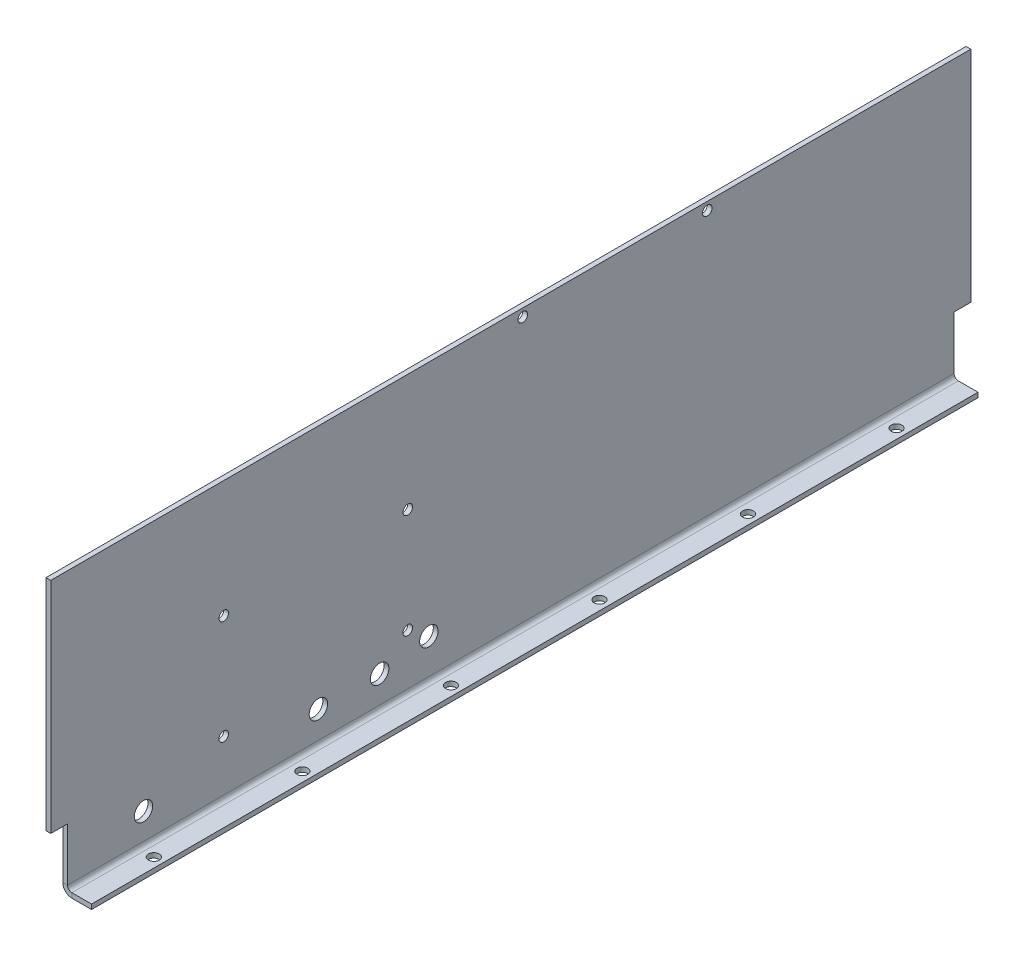
ISO-10303-21;
HEADER;
FILE_DESCRIPTION(('STEP AP214'),'2;1');
FILE_NAME('part.step','',(''),(''),'','','');
FILE_SCHEMA(('AUTOMOTIVE_DESIGN { 1 0 10303 214 1 1 1 1 }'));
ENDSEC;
DATA;
#1=APPLICATION_CONTEXT('core data for automotive mechanical design processes');
#2=APPLICATION_PROTOCOL_DEFINITION('international standard','automotive_design',2000,#1);
#3=PRODUCT_CONTEXT('',#1,'mechanical');
#4=PRODUCT('Part','Part','',(#3));
#5=PRODUCT_RELATED_PRODUCT_CATEGORY('part','',(#4));
#6=PRODUCT_DEFINITION_FORMATION('','',#4);
#7=PRODUCT_DEFINITION_CONTEXT('part definition',#1,'design');
#8=PRODUCT_DEFINITION('design','',#6,#7);
#9=PRODUCT_DEFINITION_SHAPE('','',#8);
#10=(LENGTH_UNIT() NAMED_UNIT(*) SI_UNIT(.MILLI.,.METRE.));
#11=(NAMED_UNIT(*) PLANE_ANGLE_UNIT() SI_UNIT($,.RADIAN.));
#12=(NAMED_UNIT(*) SI_UNIT($,.STERADIAN.) SOLID_ANGLE_UNIT());
#13=UNCERTAINTY_MEASURE_WITH_UNIT(LENGTH_MEASURE(1.E-05),#10,'distance_accuracy_value','');
#14=(GEOMETRIC_REPRESENTATION_CONTEXT(3) GLOBAL_UNCERTAINTY_ASSIGNED_CONTEXT((#13)) GLOBAL_UNIT_ASSIGNED_CONTEXT((#10,
#11,#12)) REPRESENTATION_CONTEXT('',''));
#15=CARTESIAN_POINT('',(0.,0.,0.));
#16=DIRECTION('',(0.,0.,1.));
#17=DIRECTION('',(1.,0.,0.));
#18=AXIS2_PLACEMENT_3D('',#15,#16,#17);
#19=CARTESIAN_POINT('',(-86.,25.9999999999999,380.000000000001));
#20=DIRECTION('',(0.,0.,-1.));
#21=DIRECTION('',(-1.,0.,0.));
#22=AXIS2_PLACEMENT_3D('',#19,#20,#21);
#23=PLANE('',#22);
#24=DIRECTION('',(0.,1.,0.));
#25=VECTOR('',#24,1.);
#26=CARTESIAN_POINT('',(0.,120.,380.000000000001));
#27=LINE('',#26,#25);
#28=CARTESIAN_POINT('',(0.,3.8,380.000000000001));
#29=VERTEX_POINT('',#28);
#30=CARTESIAN_POINT('',(0.,25.9999999999999,380.000000000001));
#31=VERTEX_POINT('',#30);
#32=EDGE_CURVE('E207',#29,#31,#27,.T.);
#33=ORIENTED_EDGE('',*,*,#32,.F.);
#34=DIRECTION('',(1.,0.,0.));
#35=VECTOR('',#34,1.);
#36=CARTESIAN_POINT('',(0.,3.8,380.000000000001));
#37=LINE('',#36,#35);
#38=CARTESIAN_POINT('',(2.,3.8,380.000000000001));
#39=VERTEX_POINT('',#38);
#40=EDGE_CURVE('E324',#29,#39,#37,.T.);
#41=ORIENTED_EDGE('',*,*,#40,.T.);
#42=DIRECTION('',(0.,1.,0.));
#43=VECTOR('',#42,1.);
#44=CARTESIAN_POINT('',(1.99999999999999,120.,380.000000000001));
#45=LINE('',#44,#43);
#46=CARTESIAN_POINT('',(2.,25.9999999999999,380.000000000001));
#47=VERTEX_POINT('',#46);
#48=EDGE_CURVE('E210',#39,#47,#45,.T.);
#49=ORIENTED_EDGE('',*,*,#48,.T.);
#50=DIRECTION('',(1.,0.,0.));
#51=VECTOR('',#50,1.);
#52=CARTESIAN_POINT('',(-86.,25.9999999999999,380.000000000001));
#53=LINE('',#52,#51);
#54=EDGE_CURVE('E192',#31,#47,#53,.T.);
#55=ORIENTED_EDGE('',*,*,#54,.F.);
#56=EDGE_LOOP('',(#33,#41,#49,#55));
#57=FACE_BOUND('',#56,.T.);
#58=ADVANCED_FACE('F38',(#57),#23,.F.);
#59=DIRECTION('',(-1.,0.,0.));
#60=VECTOR('',#59,1.);
#61=CARTESIAN_POINT('',(0.,2.,380.000000000001));
#62=LINE('',#61,#60);
#63=CARTESIAN_POINT('',(12.,2.,380.000000000001));
#64=VERTEX_POINT('',#63);
#65=CARTESIAN_POINT('',(3.8,2.,380.000000000001));
#66=VERTEX_POINT('',#65);
#67=EDGE_CURVE('E215',#64,#66,#62,.T.);
#68=ORIENTED_EDGE('',*,*,#67,.T.);
#69=DIRECTION('',(0.,-1.,0.));
#70=VECTOR('',#69,1.);
#71=CARTESIAN_POINT('',(3.8,2.,380.000000000001));
#72=LINE('',#71,#70);
#73=CARTESIAN_POINT('',(3.8,0.,380.000000000001));
#74=VERTEX_POINT('',#73);
#75=EDGE_CURVE('E322',#66,#74,#72,.T.);
#76=ORIENTED_EDGE('',*,*,#75,.T.);
#77=DIRECTION('',(1.,0.,0.));
#78=VECTOR('',#77,1.);
#79=CARTESIAN_POINT('',(-86.,0.,380.000000000001));
#80=LINE('',#79,#78);
#81=CARTESIAN_POINT('',(12.,0.,380.000000000001));
#82=VERTEX_POINT('',#81);
#83=EDGE_CURVE('E200',#74,#82,#80,.T.);
#84=ORIENTED_EDGE('',*,*,#83,.T.);
#85=DIRECTION('',(0.,1.,0.));
#86=VECTOR('',#85,1.);
#87=CARTESIAN_POINT('',(12.,25.9999999999999,380.000000000001));
#88=LINE('',#87,#86);
#89=EDGE_CURVE('E188',#82,#64,#88,.T.);
#90=ORIENTED_EDGE('',*,*,#89,.T.);
#91=EDGE_LOOP('',(#68,#76,#84,#90));
#92=FACE_BOUND('',#91,.T.);
#93=ADVANCED_FACE('F377',(#92),#23,.F.);
#94=CARTESIAN_POINT('',(-86.,25.9999999999999,9.99999999999923));
#95=DIRECTION('',(0.,0.,1.));
#96=DIRECTION('',(1.,0.,0.));
#97=AXIS2_PLACEMENT_3D('',#94,#95,#96);
#98=PLANE('',#97);
#99=DIRECTION('',(0.,-1.,0.));
#100=VECTOR('',#99,1.);
#101=CARTESIAN_POINT('',(1.99999999999999,120.,9.99999999999923));
#102=LINE('',#101,#100);
#103=CARTESIAN_POINT('',(2.,25.9999999999999,9.99999999999923));
#104=VERTEX_POINT('',#103);
#105=CARTESIAN_POINT('',(2.,3.8,9.99999999999923));
#106=VERTEX_POINT('',#105);
#107=EDGE_CURVE('E221',#104,#106,#102,.T.);
#108=ORIENTED_EDGE('',*,*,#107,.T.);
#109=DIRECTION('',(-1.,0.,0.));
#110=VECTOR('',#109,1.);
#111=CARTESIAN_POINT('',(2.,3.8,9.99999999999923));
#112=LINE('',#111,#110);
#113=CARTESIAN_POINT('',(0.,3.8,9.99999999999923));
#114=VERTEX_POINT('',#113);
#115=EDGE_CURVE('E320',#106,#114,#112,.T.);
#116=ORIENTED_EDGE('',*,*,#115,.T.);
#117=DIRECTION('',(0.,-1.,0.));
#118=VECTOR('',#117,1.);
#119=CARTESIAN_POINT('',(0.,120.,9.99999999999923));
#120=LINE('',#119,#118);
#121=CARTESIAN_POINT('',(0.,25.9999999999999,9.99999999999923));
#122=VERTEX_POINT('',#121);
#123=EDGE_CURVE('E218',#122,#114,#120,.T.);
#124=ORIENTED_EDGE('',*,*,#123,.F.);
#125=DIRECTION('',(1.,0.,0.));
#126=VECTOR('',#125,1.);
#127=CARTESIAN_POINT('',(-86.,25.9999999999999,9.99999999999923));
#128=LINE('',#127,#126);
#129=EDGE_CURVE('E191',#122,#104,#128,.T.);
#130=ORIENTED_EDGE('',*,*,#129,.T.);
#131=EDGE_LOOP('',(#108,#116,#124,#130));
#132=FACE_BOUND('',#131,.T.);
#133=ADVANCED_FACE('F336',(#132),#98,.F.);
#134=DIRECTION('',(1.,0.,0.));
#135=VECTOR('',#134,1.);
#136=CARTESIAN_POINT('',(-86.,0.,9.99999999999923));
#137=LINE('',#136,#135);
#138=CARTESIAN_POINT('',(3.8,0.,9.99999999999923));
#139=VERTEX_POINT('',#138);
#140=CARTESIAN_POINT('',(12.,0.,9.99999999999923));
#141=VERTEX_POINT('',#140);
#142=EDGE_CURVE('E193',#139,#141,#137,.T.);
#143=ORIENTED_EDGE('',*,*,#142,.F.);
#144=DIRECTION('',(0.,1.,0.));
#145=VECTOR('',#144,1.);
#146=CARTESIAN_POINT('',(3.8,0.,9.99999999999923));
#147=LINE('',#146,#145);
#148=CARTESIAN_POINT('',(3.8,2.,9.99999999999923));
#149=VERTEX_POINT('',#148);
#150=EDGE_CURVE('E300',#139,#149,#147,.T.);
#151=ORIENTED_EDGE('',*,*,#150,.T.);
#152=DIRECTION('',(1.,0.,0.));
#153=VECTOR('',#152,1.);
#154=CARTESIAN_POINT('',(0.,2.,9.99999999999923));
#155=LINE('',#154,#153);
#156=CARTESIAN_POINT('',(12.,2.,9.99999999999923));
#157=VERTEX_POINT('',#156);
#158=EDGE_CURVE('E227',#149,#157,#155,.T.);
#159=ORIENTED_EDGE('',*,*,#158,.T.);
#160=DIRECTION('',(0.,-1.,0.));
#161=VECTOR('',#160,1.);
#162=CARTESIAN_POINT('',(12.,25.9999999999999,9.99999999999923));
#163=LINE('',#162,#161);
#164=EDGE_CURVE('E189',#157,#141,#163,.T.);
#165=ORIENTED_EDGE('',*,*,#164,.T.);
#166=EDGE_LOOP('',(#143,#151,#159,#165));
#167=FACE_BOUND('',#166,.T.);
#168=ADVANCED_FACE('F353',(#167),#98,.F.);
#169=CARTESIAN_POINT('',(0.,0.,390.));
#170=DIRECTION('',(0.,1.,0.));
#171=DIRECTION('',(0.,0.,1.));
#172=AXIS2_PLACEMENT_3D('',#169,#170,#171);
#173=PLANE('',#172);
#174=CARTESIAN_POINT('',(8.,0.,350.));
#175=DIRECTION('',(0.,1.,0.));
#176=DIRECTION('',(0.,0.,1.));
#177=AXIS2_PLACEMENT_3D('',#174,#175,#176);
#178=CIRCLE('',#177,2.25);
#179=CARTESIAN_POINT('',(8.,0.,352.25));
#180=VERTEX_POINT('',#179);
#181=EDGE_CURVE('E185',#180,#180,#178,.T.);
#182=ORIENTED_EDGE('',*,*,#181,.T.);
#183=EDGE_LOOP('',(#182));
#184=FACE_BOUND('',#183,.T.);
#185=CARTESIAN_POINT('',(7.99999999999978,0.,288.));
#186=DIRECTION('',(0.,1.,0.));
#187=DIRECTION('',(0.,0.,1.));
#188=AXIS2_PLACEMENT_3D('',#185,#186,#187);
#189=CIRCLE('',#188,2.25);
#190=CARTESIAN_POINT('',(7.99999999999978,0.,290.25));
#191=VERTEX_POINT('',#190);
#192=EDGE_CURVE('E182',#191,#191,#189,.T.);
#193=ORIENTED_EDGE('',*,*,#192,.T.);
#194=EDGE_LOOP('',(#193));
#195=FACE_BOUND('',#194,.T.);
#196=CARTESIAN_POINT('',(7.99999999999957,0.,226.));
#197=DIRECTION('',(0.,1.,0.));
#198=DIRECTION('',(0.,0.,1.));
#199=AXIS2_PLACEMENT_3D('',#196,#197,#198);
#200=CIRCLE('',#199,2.25);
#201=CARTESIAN_POINT('',(7.99999999999957,0.,228.25));
#202=VERTEX_POINT('',#201);
#203=EDGE_CURVE('E179',#202,#202,#200,.T.);
#204=ORIENTED_EDGE('',*,*,#203,.T.);
#205=EDGE_LOOP('',(#204));
#206=FACE_BOUND('',#205,.T.);
#207=CARTESIAN_POINT('',(7.99999999999935,0.,164.));
#208=DIRECTION('',(0.,1.,0.));
#209=DIRECTION('',(0.,0.,1.));
#210=AXIS2_PLACEMENT_3D('',#207,#208,#209);
#211=CIRCLE('',#210,2.25);
#212=CARTESIAN_POINT('',(7.99999999999935,0.,166.25));
#213=VERTEX_POINT('',#212);
#214=EDGE_CURVE('E176',#213,#213,#211,.T.);
#215=ORIENTED_EDGE('',*,*,#214,.T.);
#216=EDGE_LOOP('',(#215));
#217=FACE_BOUND('',#216,.T.);
#218=CARTESIAN_POINT('',(7.99999999999913,0.,101.999999999999));
#219=DIRECTION('',(0.,1.,0.));
#220=DIRECTION('',(0.,0.,1.));
#221=AXIS2_PLACEMENT_3D('',#218,#219,#220);
#222=CIRCLE('',#221,2.25);
#223=CARTESIAN_POINT('',(7.99999999999913,0.,104.249999999999));
#224=VERTEX_POINT('',#223);
#225=EDGE_CURVE('E173',#224,#224,#222,.T.);
#226=ORIENTED_EDGE('',*,*,#225,.T.);
#227=EDGE_LOOP('',(#226));
#228=FACE_BOUND('',#227,.T.);
#229=CARTESIAN_POINT('',(7.99999999999946,0.,39.9999999999992));
#230=DIRECTION('',(0.,1.,0.));
#231=DIRECTION('',(0.,0.,1.));
#232=AXIS2_PLACEMENT_3D('',#229,#230,#231);
#233=CIRCLE('',#232,2.25);
#234=CARTESIAN_POINT('',(7.99999999999946,0.,42.2499999999992));
#235=VERTEX_POINT('',#234);
#236=EDGE_CURVE('E156',#235,#235,#233,.T.);
#237=ORIENTED_EDGE('',*,*,#236,.T.);
#238=EDGE_LOOP('',(#237));
#239=FACE_BOUND('',#238,.T.);
#240=DIRECTION('',(0.,0.,-1.));
#241=VECTOR('',#240,1.);
#242=CARTESIAN_POINT('',(3.8,0.,390.));
#243=LINE('',#242,#241);
#244=EDGE_CURVE('E271',#74,#139,#243,.T.);
#245=ORIENTED_EDGE('',*,*,#244,.T.);
#246=ORIENTED_EDGE('',*,*,#142,.T.);
#247=DIRECTION('',(0.,0.,-1.));
#248=VECTOR('',#247,1.);
#249=CARTESIAN_POINT('',(12.,0.,390.));
#250=LINE('',#249,#248);
#251=EDGE_CURVE('E286',#82,#141,#250,.T.);
#252=ORIENTED_EDGE('',*,*,#251,.F.);
#253=ORIENTED_EDGE('',*,*,#83,.F.);
#254=EDGE_LOOP('',(#245,#246,#252,#253));
#255=FACE_BOUND('',#254,.T.);
#256=ADVANCED_FACE('F40',(#184,#195,#206,#217,#228,#239,#255),#173,.F.);
#257=CARTESIAN_POINT('',(12.,2.,390.));
#258=DIRECTION('',(1.,0.,0.));
#259=DIRECTION('',(0.,0.,-1.));
#260=AXIS2_PLACEMENT_3D('',#257,#258,#259);
#261=PLANE('',#260);
#262=ORIENTED_EDGE('',*,*,#164,.F.);
#263=DIRECTION('',(0.,0.,-1.));
#264=VECTOR('',#263,1.);
#265=CARTESIAN_POINT('',(12.,2.,390.));
#266=LINE('',#265,#264);
#267=EDGE_CURVE('E283',#64,#157,#266,.T.);
#268=ORIENTED_EDGE('',*,*,#267,.F.);
#269=ORIENTED_EDGE('',*,*,#89,.F.);
#270=ORIENTED_EDGE('',*,*,#251,.T.);
#271=EDGE_LOOP('',(#262,#268,#269,#270));
#272=FACE_BOUND('',#271,.T.);
#273=ADVANCED_FACE('F355',(#272),#261,.T.);
#274=CARTESIAN_POINT('',(0.,2.,390.));
#275=DIRECTION('',(0.,1.,0.));
#276=DIRECTION('',(0.,0.,1.));
#277=AXIS2_PLACEMENT_3D('',#274,#275,#276);
#278=PLANE('',#277);
#279=CARTESIAN_POINT('',(8.,2.,350.));
#280=DIRECTION('',(0.,1.,0.));
#281=DIRECTION('',(0.,0.,1.));
#282=AXIS2_PLACEMENT_3D('',#279,#280,#281);
#283=CIRCLE('',#282,2.25);
#284=CARTESIAN_POINT('',(8.,2.,352.25));
#285=VERTEX_POINT('',#284);
#286=EDGE_CURVE('E153',#285,#285,#283,.T.);
#287=ORIENTED_EDGE('',*,*,#286,.F.);
#288=EDGE_LOOP('',(#287));
#289=FACE_BOUND('',#288,.T.);
#290=CARTESIAN_POINT('',(7.99999999999978,2.,288.));
#291=DIRECTION('',(0.,1.,0.));
#292=DIRECTION('',(0.,0.,1.));
#293=AXIS2_PLACEMENT_3D('',#290,#291,#292);
#294=CIRCLE('',#293,2.25);
#295=CARTESIAN_POINT('',(7.99999999999978,2.,290.25));
#296=VERTEX_POINT('',#295);
#297=EDGE_CURVE('E157',#296,#296,#294,.T.);
#298=ORIENTED_EDGE('',*,*,#297,.F.);
#299=EDGE_LOOP('',(#298));
#300=FACE_BOUND('',#299,.T.);
#301=CARTESIAN_POINT('',(7.99999999999957,2.,226.));
#302=DIRECTION('',(0.,1.,0.));
#303=DIRECTION('',(0.,0.,1.));
#304=AXIS2_PLACEMENT_3D('',#301,#302,#303);
#305=CIRCLE('',#304,2.25);
#306=CARTESIAN_POINT('',(7.99999999999957,2.,228.25));
#307=VERTEX_POINT('',#306);
#308=EDGE_CURVE('E160',#307,#307,#305,.T.);
#309=ORIENTED_EDGE('',*,*,#308,.F.);
#310=EDGE_LOOP('',(#309));
#311=FACE_BOUND('',#310,.T.);
#312=CARTESIAN_POINT('',(7.99999999999935,2.,164.));
#313=DIRECTION('',(0.,1.,0.));
#314=DIRECTION('',(0.,0.,1.));
#315=AXIS2_PLACEMENT_3D('',#312,#313,#314);
#316=CIRCLE('',#315,2.25);
#317=CARTESIAN_POINT('',(7.99999999999935,2.,166.25));
#318=VERTEX_POINT('',#317);
#319=EDGE_CURVE('E163',#318,#318,#316,.T.);
#320=ORIENTED_EDGE('',*,*,#319,.F.);
#321=EDGE_LOOP('',(#320));
#322=FACE_BOUND('',#321,.T.);
#323=CARTESIAN_POINT('',(7.99999999999913,2.,101.999999999999));
#324=DIRECTION('',(0.,1.,0.));
#325=DIRECTION('',(0.,0.,1.));
#326=AXIS2_PLACEMENT_3D('',#323,#324,#325);
#327=CIRCLE('',#326,2.25);
#328=CARTESIAN_POINT('',(7.99999999999913,2.,104.249999999999));
#329=VERTEX_POINT('',#328);
#330=EDGE_CURVE('E166',#329,#329,#327,.T.);
#331=ORIENTED_EDGE('',*,*,#330,.F.);
#332=EDGE_LOOP('',(#331));
#333=FACE_BOUND('',#332,.T.);
#334=CARTESIAN_POINT('',(7.99999999999946,2.,39.9999999999992));
#335=DIRECTION('',(0.,1.,0.));
#336=DIRECTION('',(0.,0.,1.));
#337=AXIS2_PLACEMENT_3D('',#334,#335,#336);
#338=CIRCLE('',#337,2.25);
#339=CARTESIAN_POINT('',(7.99999999999946,2.,42.2499999999992));
#340=VERTEX_POINT('',#339);
#341=EDGE_CURVE('E146',#340,#340,#338,.T.);
#342=ORIENTED_EDGE('',*,*,#341,.F.);
#343=EDGE_LOOP('',(#342));
#344=FACE_BOUND('',#343,.T.);
#345=ORIENTED_EDGE('',*,*,#158,.F.);
#346=DIRECTION('',(0.,0.,-1.));
#347=VECTOR('',#346,1.);
#348=CARTESIAN_POINT('',(3.8,2.,390.));
#349=LINE('',#348,#347);
#350=EDGE_CURVE('E280',#66,#149,#349,.T.);
#351=ORIENTED_EDGE('',*,*,#350,.F.);
#352=ORIENTED_EDGE('',*,*,#67,.F.);
#353=ORIENTED_EDGE('',*,*,#267,.T.);
#354=EDGE_LOOP('',(#345,#351,#352,#353));
#355=FACE_BOUND('',#354,.T.);
#356=ADVANCED_FACE('F348',(#289,#300,#311,#322,#333,#344,#355),#278,.T.);
#357=CARTESIAN_POINT('',(3.8,3.8,390.));
#358=DIRECTION('',(0.,0.,-1.));
#359=DIRECTION('',(-1.,0.,0.));
#360=AXIS2_PLACEMENT_3D('',#357,#358,#359);
#361=CYLINDRICAL_SURFACE('',#360,1.8);
#362=CARTESIAN_POINT('',(3.8,3.8,9.99999999999923));
#363=DIRECTION('',(0.,0.,1.));
#364=DIRECTION('',(1.,0.,0.));
#365=AXIS2_PLACEMENT_3D('',#362,#363,#364);
#366=CIRCLE('',#365,1.8);
#367=EDGE_CURVE('E224',#106,#149,#366,.T.);
#368=ORIENTED_EDGE('',*,*,#367,.F.);
#369=DIRECTION('',(0.,0.,-1.));
#370=VECTOR('',#369,1.);
#371=CARTESIAN_POINT('',(2.,3.8,390.));
#372=LINE('',#371,#370);
#373=EDGE_CURVE('E277',#39,#106,#372,.T.);
#374=ORIENTED_EDGE('',*,*,#373,.F.);
#375=CARTESIAN_POINT('',(3.8,3.8,380.000000000001));
#376=DIRECTION('',(0.,0.,-1.));
#377=DIRECTION('',(-1.,0.,0.));
#378=AXIS2_PLACEMENT_3D('',#375,#376,#377);
#379=CIRCLE('',#378,1.8);
#380=EDGE_CURVE('E212',#66,#39,#379,.T.);
#381=ORIENTED_EDGE('',*,*,#380,.F.);
#382=ORIENTED_EDGE('',*,*,#350,.T.);
#383=EDGE_LOOP('',(#368,#374,#381,#382));
#384=FACE_BOUND('',#383,.T.);
#385=ADVANCED_FACE('F340',(#384),#361,.F.);
#386=CARTESIAN_POINT('',(1.99999999999999,120.,390.));
#387=DIRECTION('',(1.,0.,0.));
#388=DIRECTION('',(0.,1.,0.));
#389=AXIS2_PLACEMENT_3D('',#386,#387,#388);
#390=PLANE('',#389);
#391=DIRECTION('',(0.,0.,-1.));
#392=VECTOR('',#391,1.);
#393=CARTESIAN_POINT('',(1.99999999999999,117.5,387.));
#394=LINE('',#393,#392);
#395=CARTESIAN_POINT('',(1.99999999999999,117.5,387.));
#396=VERTEX_POINT('',#395);
#397=CARTESIAN_POINT('',(1.99999999999999,117.5,3.));
#398=VERTEX_POINT('',#397);
#399=EDGE_CURVE('E53',#396,#398,#394,.T.);
#400=ORIENTED_EDGE('',*,*,#399,.F.);
#401=DIRECTION('',(0.,1.,0.));
#402=VECTOR('',#401,1.);
#403=CARTESIAN_POINT('',(1.99999999999999,120.,387.));
#404=LINE('',#403,#402);
#405=CARTESIAN_POINT('',(2.,26.,387.));
#406=VERTEX_POINT('',#405);
#407=EDGE_CURVE('E137',#406,#396,#404,.T.);
#408=ORIENTED_EDGE('',*,*,#407,.F.);
#409=DIRECTION('',(0.,0.,1.));
#410=VECTOR('',#409,1.);
#411=CARTESIAN_POINT('',(2.,25.9999999999999,390.));
#412=LINE('',#411,#410);
#413=EDGE_CURVE('E233',#47,#406,#412,.T.);
#414=ORIENTED_EDGE('',*,*,#413,.F.);
#415=ORIENTED_EDGE('',*,*,#48,.F.);
#416=ORIENTED_EDGE('',*,*,#373,.T.);
#417=ORIENTED_EDGE('',*,*,#107,.F.);
#418=DIRECTION('',(0.,0.,1.));
#419=VECTOR('',#418,1.);
#420=CARTESIAN_POINT('',(2.,25.9999999999999,390.));
#421=LINE('',#420,#419);
#422=CARTESIAN_POINT('',(2.,25.9999999999999,3.));
#423=VERTEX_POINT('',#422);
#424=EDGE_CURVE('E205',#423,#104,#421,.T.);
#425=ORIENTED_EDGE('',*,*,#424,.F.);
#426=DIRECTION('',(0.,-1.,0.));
#427=VECTOR('',#426,1.);
#428=CARTESIAN_POINT('',(1.99999999999999,120.,3.));
#429=LINE('',#428,#427);
#430=EDGE_CURVE('E59',#398,#423,#429,.T.);
#431=ORIENTED_EDGE('',*,*,#430,.F.);
#432=EDGE_LOOP('',(#400,#408,#414,#415,#416,#417,#425,#431));
#433=FACE_BOUND('',#432,.T.);
#434=CARTESIAN_POINT('',(1.99999999999999,114.2,113.));
#435=DIRECTION('',(1.,0.,0.));
#436=DIRECTION('',(0.,1.,0.));
#437=AXIS2_PLACEMENT_3D('',#434,#435,#436);
#438=CIRCLE('',#437,1.99999999999979);
#439=CARTESIAN_POINT('',(1.99999999999999,116.2,113.));
#440=VERTEX_POINT('',#439);
#441=EDGE_CURVE('E268',#440,#440,#438,.T.);
#442=ORIENTED_EDGE('',*,*,#441,.F.);
#443=EDGE_LOOP('',(#442));
#444=FACE_BOUND('',#443,.T.);
#445=CARTESIAN_POINT('',(1.99999999999999,114.2,190.));
#446=DIRECTION('',(1.,0.,0.));
#447=DIRECTION('',(0.,1.,0.));
#448=AXIS2_PLACEMENT_3D('',#445,#446,#447);
#449=CIRCLE('',#448,1.99999999999982);
#450=CARTESIAN_POINT('',(1.99999999999999,116.2,190.));
#451=VERTEX_POINT('',#450);
#452=EDGE_CURVE('E264',#451,#451,#449,.T.);
#453=ORIENTED_EDGE('',*,*,#452,.F.);
#454=EDGE_LOOP('',(#453));
#455=FACE_BOUND('',#454,.T.);
#456=CARTESIAN_POINT('',(1.99999999999999,18.4,229.2));
#457=DIRECTION('',(1.,0.,0.));
#458=DIRECTION('',(0.,1.,0.));
#459=AXIS2_PLACEMENT_3D('',#456,#457,#458);
#460=CIRCLE('',#459,3.85);
#461=CARTESIAN_POINT('',(1.99999999999999,22.25,229.2));
#462=VERTEX_POINT('',#461);
#463=EDGE_CURVE('E260',#462,#462,#460,.T.);
#464=ORIENTED_EDGE('',*,*,#463,.F.);
#465=EDGE_LOOP('',(#464));
#466=FACE_BOUND('',#465,.T.);
#467=CARTESIAN_POINT('',(1.99999999999999,15.1,249.75));
#468=DIRECTION('',(1.,0.,0.));
#469=DIRECTION('',(0.,1.,0.));
#470=AXIS2_PLACEMENT_3D('',#467,#468,#469);
#471=CIRCLE('',#470,3.85);
#472=CARTESIAN_POINT('',(1.99999999999999,18.95,249.75));
#473=VERTEX_POINT('',#472);
#474=EDGE_CURVE('E256',#473,#473,#471,.T.);
#475=ORIENTED_EDGE('',*,*,#474,.F.);
#476=EDGE_LOOP('',(#475));
#477=FACE_BOUND('',#476,.T.);
#478=CARTESIAN_POINT('',(1.99999999999999,68.6,314.8));
#479=DIRECTION('',(1.,0.,0.));
#480=DIRECTION('',(0.,1.,0.));
#481=AXIS2_PLACEMENT_3D('',#478,#479,#480);
#482=CIRCLE('',#481,2.);
#483=CARTESIAN_POINT('',(1.99999999999999,70.6,314.8));
#484=VERTEX_POINT('',#483);
#485=EDGE_CURVE('E252',#484,#484,#482,.T.);
#486=ORIENTED_EDGE('',*,*,#485,.F.);
#487=EDGE_LOOP('',(#486));
#488=FACE_BOUND('',#487,.T.);
#489=CARTESIAN_POINT('',(1.99999999999999,25.,238.));
#490=DIRECTION('',(1.,0.,0.));
#491=DIRECTION('',(0.,1.,0.));
#492=AXIS2_PLACEMENT_3D('',#489,#490,#491);
#493=CIRCLE('',#492,2.);
#494=CARTESIAN_POINT('',(1.99999999999999,27.,238.));
#495=VERTEX_POINT('',#494);
#496=EDGE_CURVE('E248',#495,#495,#493,.T.);
#497=ORIENTED_EDGE('',*,*,#496,.F.);
#498=EDGE_LOOP('',(#497));
#499=FACE_BOUND('',#498,.T.);
#500=CARTESIAN_POINT('',(1.99999999999999,68.6,238.));
#501=DIRECTION('',(1.,0.,0.));
#502=DIRECTION('',(0.,1.,0.));
#503=AXIS2_PLACEMENT_3D('',#500,#501,#502);
#504=CIRCLE('',#503,2.);
#505=CARTESIAN_POINT('',(1.99999999999999,70.6,238.));
#506=VERTEX_POINT('',#505);
#507=EDGE_CURVE('E244',#506,#506,#504,.T.);
#508=ORIENTED_EDGE('',*,*,#507,.F.);
#509=EDGE_LOOP('',(#508));
#510=FACE_BOUND('',#509,.T.);
#511=CARTESIAN_POINT('',(1.99999999999999,15.1,275.3));
#512=DIRECTION('',(1.,0.,0.));
#513=DIRECTION('',(0.,1.,0.));
#514=AXIS2_PLACEMENT_3D('',#511,#512,#513);
#515=CIRCLE('',#514,3.85000000000003);
#516=CARTESIAN_POINT('',(1.99999999999999,18.95,275.3));
#517=VERTEX_POINT('',#516);
#518=EDGE_CURVE('E240',#517,#517,#515,.T.);
#519=ORIENTED_EDGE('',*,*,#518,.F.);
#520=EDGE_LOOP('',(#519));
#521=FACE_BOUND('',#520,.T.);
#522=CARTESIAN_POINT('',(1.99999999999999,14.7,348.3));
#523=DIRECTION('',(1.,0.,0.));
#524=DIRECTION('',(0.,1.,0.));
#525=AXIS2_PLACEMENT_3D('',#522,#523,#524);
#526=CIRCLE('',#525,3.85000000000003);
#527=CARTESIAN_POINT('',(1.99999999999999,18.55,348.3));
#528=VERTEX_POINT('',#527);
#529=EDGE_CURVE('E236',#528,#528,#526,.T.);
#530=ORIENTED_EDGE('',*,*,#529,.F.);
#531=EDGE_LOOP('',(#530));
#532=FACE_BOUND('',#531,.T.);
#533=CARTESIAN_POINT('',(1.99999999999999,25.,314.8));
#534=DIRECTION('',(1.,0.,0.));
#535=DIRECTION('',(0.,1.,0.));
#536=AXIS2_PLACEMENT_3D('',#533,#534,#535);
#537=CIRCLE('',#536,2.);
#538=CARTESIAN_POINT('',(1.99999999999999,27.,314.8));
#539=VERTEX_POINT('',#538);
#540=EDGE_CURVE('E230',#539,#539,#537,.T.);
#541=ORIENTED_EDGE('',*,*,#540,.F.);
#542=EDGE_LOOP('',(#541));
#543=FACE_BOUND('',#542,.T.);
#544=ADVANCED_FACE('F134',(#433,#444,#455,#466,#477,#488,#499,#510,#521,#532,#543),#390,.T.);
#545=CARTESIAN_POINT('',(0.,120.,390.));
#546=DIRECTION('',(1.,0.,0.));
#547=DIRECTION('',(0.,1.,0.));
#548=AXIS2_PLACEMENT_3D('',#545,#546,#547);
#549=PLANE('',#548);
#550=CARTESIAN_POINT('',(0.,114.2,113.));
#551=DIRECTION('',(1.,0.,0.));
#552=DIRECTION('',(0.,1.,0.));
#553=AXIS2_PLACEMENT_3D('',#550,#551,#552);
#554=CIRCLE('',#553,1.99999999999979);
#555=CARTESIAN_POINT('',(0.,116.2,113.));
#556=VERTEX_POINT('',#555);
#557=EDGE_CURVE('E267',#556,#556,#554,.T.);
#558=ORIENTED_EDGE('',*,*,#557,.T.);
#559=EDGE_LOOP('',(#558));
#560=FACE_BOUND('',#559,.T.);
#561=CARTESIAN_POINT('',(0.,114.2,190.));
#562=DIRECTION('',(1.,0.,0.));
#563=DIRECTION('',(0.,1.,0.));
#564=AXIS2_PLACEMENT_3D('',#561,#562,#563);
#565=CIRCLE('',#564,1.99999999999982);
#566=CARTESIAN_POINT('',(0.,116.2,190.));
#567=VERTEX_POINT('',#566);
#568=EDGE_CURVE('E263',#567,#567,#565,.T.);
#569=ORIENTED_EDGE('',*,*,#568,.T.);
#570=EDGE_LOOP('',(#569));
#571=FACE_BOUND('',#570,.T.);
#572=CARTESIAN_POINT('',(0.,18.4,229.2));
#573=DIRECTION('',(1.,0.,0.));
#574=DIRECTION('',(0.,1.,0.));
#575=AXIS2_PLACEMENT_3D('',#572,#573,#574);
#576=CIRCLE('',#575,3.85);
#577=CARTESIAN_POINT('',(0.,22.25,229.2));
#578=VERTEX_POINT('',#577);
#579=EDGE_CURVE('E259',#578,#578,#576,.T.);
#580=ORIENTED_EDGE('',*,*,#579,.T.);
#581=EDGE_LOOP('',(#580));
#582=FACE_BOUND('',#581,.T.);
#583=CARTESIAN_POINT('',(0.,15.1,249.75));
#584=DIRECTION('',(1.,0.,0.));
#585=DIRECTION('',(0.,1.,0.));
#586=AXIS2_PLACEMENT_3D('',#583,#584,#585);
#587=CIRCLE('',#586,3.85);
#588=CARTESIAN_POINT('',(0.,18.95,249.75));
#589=VERTEX_POINT('',#588);
#590=EDGE_CURVE('E255',#589,#589,#587,.T.);
#591=ORIENTED_EDGE('',*,*,#590,.T.);
#592=EDGE_LOOP('',(#591));
#593=FACE_BOUND('',#592,.T.);
#594=CARTESIAN_POINT('',(0.,68.6,314.8));
#595=DIRECTION('',(1.,0.,0.));
#596=DIRECTION('',(0.,1.,0.));
#597=AXIS2_PLACEMENT_3D('',#594,#595,#596);
#598=CIRCLE('',#597,2.);
#599=CARTESIAN_POINT('',(0.,70.6,314.8));
#600=VERTEX_POINT('',#599);
#601=EDGE_CURVE('E251',#600,#600,#598,.T.);
#602=ORIENTED_EDGE('',*,*,#601,.T.);
#603=EDGE_LOOP('',(#602));
#604=FACE_BOUND('',#603,.T.);
#605=CARTESIAN_POINT('',(0.,25.,238.));
#606=DIRECTION('',(1.,0.,0.));
#607=DIRECTION('',(0.,1.,0.));
#608=AXIS2_PLACEMENT_3D('',#605,#606,#607);
#609=CIRCLE('',#608,2.);
#610=CARTESIAN_POINT('',(0.,27.,238.));
#611=VERTEX_POINT('',#610);
#612=EDGE_CURVE('E247',#611,#611,#609,.T.);
#613=ORIENTED_EDGE('',*,*,#612,.T.);
#614=EDGE_LOOP('',(#613));
#615=FACE_BOUND('',#614,.T.);
#616=CARTESIAN_POINT('',(0.,68.6,238.));
#617=DIRECTION('',(1.,0.,0.));
#618=DIRECTION('',(0.,1.,0.));
#619=AXIS2_PLACEMENT_3D('',#616,#617,#618);
#620=CIRCLE('',#619,2.);
#621=CARTESIAN_POINT('',(0.,70.6,238.));
#622=VERTEX_POINT('',#621);
#623=EDGE_CURVE('E243',#622,#622,#620,.T.);
#624=ORIENTED_EDGE('',*,*,#623,.T.);
#625=EDGE_LOOP('',(#624));
#626=FACE_BOUND('',#625,.T.);
#627=CARTESIAN_POINT('',(0.,15.1,275.3));
#628=DIRECTION('',(1.,0.,0.));
#629=DIRECTION('',(0.,1.,0.));
#630=AXIS2_PLACEMENT_3D('',#627,#628,#629);
#631=CIRCLE('',#630,3.85000000000003);
#632=CARTESIAN_POINT('',(0.,18.95,275.3));
#633=VERTEX_POINT('',#632);
#634=EDGE_CURVE('E239',#633,#633,#631,.T.);
#635=ORIENTED_EDGE('',*,*,#634,.T.);
#636=EDGE_LOOP('',(#635));
#637=FACE_BOUND('',#636,.T.);
#638=CARTESIAN_POINT('',(0.,14.7,348.3));
#639=DIRECTION('',(1.,0.,0.));
#640=DIRECTION('',(0.,1.,0.));
#641=AXIS2_PLACEMENT_3D('',#638,#639,#640);
#642=CIRCLE('',#641,3.85000000000003);
#643=CARTESIAN_POINT('',(0.,18.55,348.3));
#644=VERTEX_POINT('',#643);
#645=EDGE_CURVE('E235',#644,#644,#642,.T.);
#646=ORIENTED_EDGE('',*,*,#645,.T.);
#647=EDGE_LOOP('',(#646));
#648=FACE_BOUND('',#647,.T.);
#649=CARTESIAN_POINT('',(0.,25.,314.8));
#650=DIRECTION('',(1.,0.,0.));
#651=DIRECTION('',(0.,1.,0.));
#652=AXIS2_PLACEMENT_3D('',#649,#650,#651);
#653=CIRCLE('',#652,2.);
#654=CARTESIAN_POINT('',(0.,27.,314.8));
#655=VERTEX_POINT('',#654);
#656=EDGE_CURVE('E229',#655,#655,#653,.T.);
#657=ORIENTED_EDGE('',*,*,#656,.T.);
#658=EDGE_LOOP('',(#657));
#659=FACE_BOUND('',#658,.T.);
#660=DIRECTION('',(0.,-1.,0.));
#661=VECTOR('',#660,1.);
#662=CARTESIAN_POINT('',(0.,26.,387.));
#663=LINE('',#662,#661);
#664=CARTESIAN_POINT('',(0.,117.5,387.));
#665=VERTEX_POINT('',#664);
#666=CARTESIAN_POINT('',(0.,25.9999999999999,387.));
#667=VERTEX_POINT('',#666);
#668=EDGE_CURVE('E149',#665,#667,#663,.T.);
#669=ORIENTED_EDGE('',*,*,#668,.F.);
#670=DIRECTION('',(0.,0.,-1.));
#671=VECTOR('',#670,1.);
#672=CARTESIAN_POINT('',(0.,117.5,390.));
#673=LINE('',#672,#671);
#674=CARTESIAN_POINT('',(0.,117.5,3.));
#675=VERTEX_POINT('',#674);
#676=EDGE_CURVE('E127',#665,#675,#673,.T.);
#677=ORIENTED_EDGE('',*,*,#676,.T.);
#678=DIRECTION('',(0.,1.,0.));
#679=VECTOR('',#678,1.);
#680=CARTESIAN_POINT('',(0.,25.9999999999999,3.));
#681=LINE('',#680,#679);
#682=CARTESIAN_POINT('',(0.,25.9999999999999,3.));
#683=VERTEX_POINT('',#682);
#684=EDGE_CURVE('E144',#683,#675,#681,.T.);
#685=ORIENTED_EDGE('',*,*,#684,.F.);
#686=DIRECTION('',(0.,0.,1.));
#687=VECTOR('',#686,1.);
#688=CARTESIAN_POINT('',(0.,25.9999999999999,390.));
#689=LINE('',#688,#687);
#690=EDGE_CURVE('E196',#683,#122,#689,.T.);
#691=ORIENTED_EDGE('',*,*,#690,.T.);
#692=ORIENTED_EDGE('',*,*,#123,.T.);
#693=DIRECTION('',(0.,0.,-1.));
#694=VECTOR('',#693,1.);
#695=CARTESIAN_POINT('',(0.,3.8,390.));
#696=LINE('',#695,#694);
#697=EDGE_CURVE('E274',#29,#114,#696,.T.);
#698=ORIENTED_EDGE('',*,*,#697,.F.);
#699=ORIENTED_EDGE('',*,*,#32,.T.);
#700=DIRECTION('',(0.,0.,1.));
#701=VECTOR('',#700,1.);
#702=CARTESIAN_POINT('',(0.,25.9999999999999,390.));
#703=LINE('',#702,#701);
#704=EDGE_CURVE('E295',#31,#667,#703,.T.);
#705=ORIENTED_EDGE('',*,*,#704,.T.);
#706=EDGE_LOOP('',(#669,#677,#685,#691,#692,#698,#699,#705));
#707=FACE_BOUND('',#706,.T.);
#708=ADVANCED_FACE('F365',(#560,#571,#582,#593,#604,#615,#626,#637,#648,#659,#707),#549,.F.);
#709=CARTESIAN_POINT('',(3.8,3.8,390.));
#710=DIRECTION('',(0.,0.,-1.));
#711=DIRECTION('',(-1.,0.,0.));
#712=AXIS2_PLACEMENT_3D('',#709,#710,#711);
#713=CYLINDRICAL_SURFACE('',#712,3.8);
#714=ORIENTED_EDGE('',*,*,#697,.T.);
#715=CARTESIAN_POINT('',(3.8,3.8,9.99999999999923));
#716=DIRECTION('',(0.,0.,1.));
#717=DIRECTION('',(1.,0.,0.));
#718=AXIS2_PLACEMENT_3D('',#715,#716,#717);
#719=CIRCLE('',#718,3.8);
#720=EDGE_CURVE('E292',#114,#139,#719,.T.);
#721=ORIENTED_EDGE('',*,*,#720,.T.);
#722=ORIENTED_EDGE('',*,*,#244,.F.);
#723=CARTESIAN_POINT('',(3.8,3.8,380.000000000001));
#724=DIRECTION('',(0.,0.,-1.));
#725=DIRECTION('',(-1.,0.,0.));
#726=AXIS2_PLACEMENT_3D('',#723,#724,#725);
#727=CIRCLE('',#726,3.8);
#728=EDGE_CURVE('E289',#74,#29,#727,.T.);
#729=ORIENTED_EDGE('',*,*,#728,.T.);
#730=EDGE_LOOP('',(#714,#721,#722,#729));
#731=FACE_BOUND('',#730,.T.);
#732=ADVANCED_FACE('F362',(#731),#713,.T.);
#733=ORIENTED_EDGE('',*,*,#115,.F.);
#734=ORIENTED_EDGE('',*,*,#367,.T.);
#735=ORIENTED_EDGE('',*,*,#150,.F.);
#736=ORIENTED_EDGE('',*,*,#720,.F.);
#737=EDGE_LOOP('',(#733,#734,#735,#736));
#738=FACE_BOUND('',#737,.T.);
#739=ADVANCED_FACE('F345',(#738),#98,.F.);
#740=CARTESIAN_POINT('',(-86.,25.9999999999999,9.99999999999923));
#741=DIRECTION('',(0.,1.,0.));
#742=DIRECTION('',(0.,0.,1.));
#743=AXIS2_PLACEMENT_3D('',#740,#741,#742);
#744=PLANE('',#743);
#745=ORIENTED_EDGE('',*,*,#690,.F.);
#746=DIRECTION('',(1.,0.,0.));
#747=VECTOR('',#746,1.);
#748=CARTESIAN_POINT('',(-86.,25.9999999999999,3.));
#749=LINE('',#748,#747);
#750=EDGE_CURVE('E46',#683,#423,#749,.T.);
#751=ORIENTED_EDGE('',*,*,#750,.T.);
#752=ORIENTED_EDGE('',*,*,#424,.T.);
#753=ORIENTED_EDGE('',*,*,#129,.F.);
#754=EDGE_LOOP('',(#745,#751,#752,#753));
#755=FACE_BOUND('',#754,.T.);
#756=ADVANCED_FACE('F328',(#755),#744,.F.);
#757=CARTESIAN_POINT('',(-86.,25.9999999999999,380.000000000001));
#758=DIRECTION('',(0.,1.,0.));
#759=DIRECTION('',(0.,0.,1.));
#760=AXIS2_PLACEMENT_3D('',#757,#758,#759);
#761=PLANE('',#760);
#762=ORIENTED_EDGE('',*,*,#413,.T.);
#763=DIRECTION('',(-1.,0.,0.));
#764=VECTOR('',#763,1.);
#765=CARTESIAN_POINT('',(-86.,25.9999999999999,387.));
#766=LINE('',#765,#764);
#767=EDGE_CURVE('E143',#406,#667,#766,.T.);
#768=ORIENTED_EDGE('',*,*,#767,.T.);
#769=ORIENTED_EDGE('',*,*,#704,.F.);
#770=ORIENTED_EDGE('',*,*,#54,.T.);
#771=EDGE_LOOP('',(#762,#768,#769,#770));
#772=FACE_BOUND('',#771,.T.);
#773=ADVANCED_FACE('F390',(#772),#761,.F.);
#774=ORIENTED_EDGE('',*,*,#40,.F.);
#775=ORIENTED_EDGE('',*,*,#728,.F.);
#776=ORIENTED_EDGE('',*,*,#75,.F.);
#777=ORIENTED_EDGE('',*,*,#380,.T.);
#778=EDGE_LOOP('',(#774,#775,#776,#777));
#779=FACE_BOUND('',#778,.T.);
#780=ADVANCED_FACE('F380',(#779),#23,.F.);
#781=CARTESIAN_POINT('',(-86.,25.,314.8));
#782=DIRECTION('',(1.,0.,0.));
#783=DIRECTION('',(0.,0.,-1.));
#784=AXIS2_PLACEMENT_3D('',#781,#782,#783);
#785=CYLINDRICAL_SURFACE('',#784,2.);
#786=ORIENTED_EDGE('',*,*,#540,.T.);
#787=EDGE_LOOP('',(#786));
#788=FACE_BOUND('',#787,.T.);
#789=ORIENTED_EDGE('',*,*,#656,.F.);
#790=EDGE_LOOP('',(#789));
#791=FACE_BOUND('',#790,.T.);
#792=ADVANCED_FACE('F389',(#788,#791),#785,.F.);
#793=CARTESIAN_POINT('',(-86.,14.7,348.3));
#794=DIRECTION('',(1.,0.,0.));
#795=DIRECTION('',(0.,0.,-1.));
#796=AXIS2_PLACEMENT_3D('',#793,#794,#795);
#797=CYLINDRICAL_SURFACE('',#796,3.85000000000003);
#798=ORIENTED_EDGE('',*,*,#529,.T.);
#799=EDGE_LOOP('',(#798));
#800=FACE_BOUND('',#799,.T.);
#801=ORIENTED_EDGE('',*,*,#645,.F.);
#802=EDGE_LOOP('',(#801));
#803=FACE_BOUND('',#802,.T.);
#804=ADVANCED_FACE('F396',(#800,#803),#797,.F.);
#805=CARTESIAN_POINT('',(-86.,15.1,275.3));
#806=DIRECTION('',(1.,0.,0.));
#807=DIRECTION('',(0.,0.,-1.));
#808=AXIS2_PLACEMENT_3D('',#805,#806,#807);
#809=CYLINDRICAL_SURFACE('',#808,3.85000000000003);
#810=ORIENTED_EDGE('',*,*,#518,.T.);
#811=EDGE_LOOP('',(#810));
#812=FACE_BOUND('',#811,.T.);
#813=ORIENTED_EDGE('',*,*,#634,.F.);
#814=EDGE_LOOP('',(#813));
#815=FACE_BOUND('',#814,.T.);
#816=ADVANCED_FACE('F412',(#812,#815),#809,.F.);
#817=CARTESIAN_POINT('',(-86.,68.6,238.));
#818=DIRECTION('',(1.,0.,0.));
#819=DIRECTION('',(0.,0.,-1.));
#820=AXIS2_PLACEMENT_3D('',#817,#818,#819);
#821=CYLINDRICAL_SURFACE('',#820,2.);
#822=ORIENTED_EDGE('',*,*,#507,.T.);
#823=EDGE_LOOP('',(#822));
#824=FACE_BOUND('',#823,.T.);
#825=ORIENTED_EDGE('',*,*,#623,.F.);
#826=EDGE_LOOP('',(#825));
#827=FACE_BOUND('',#826,.T.);
#828=ADVANCED_FACE('F606',(#824,#827),#821,.F.);
#829=CARTESIAN_POINT('',(-86.,25.,238.));
#830=DIRECTION('',(1.,0.,0.));
#831=DIRECTION('',(0.,0.,-1.));
#832=AXIS2_PLACEMENT_3D('',#829,#830,#831);
#833=CYLINDRICAL_SURFACE('',#832,2.);
#834=ORIENTED_EDGE('',*,*,#496,.T.);
#835=EDGE_LOOP('',(#834));
#836=FACE_BOUND('',#835,.T.);
#837=ORIENTED_EDGE('',*,*,#612,.F.);
#838=EDGE_LOOP('',(#837));
#839=FACE_BOUND('',#838,.T.);
#840=ADVANCED_FACE('F595',(#836,#839),#833,.F.);
#841=CARTESIAN_POINT('',(-86.,68.6,314.8));
#842=DIRECTION('',(1.,0.,0.));
#843=DIRECTION('',(0.,0.,-1.));
#844=AXIS2_PLACEMENT_3D('',#841,#842,#843);
#845=CYLINDRICAL_SURFACE('',#844,2.);
#846=ORIENTED_EDGE('',*,*,#485,.T.);
#847=EDGE_LOOP('',(#846));
#848=FACE_BOUND('',#847,.T.);
#849=ORIENTED_EDGE('',*,*,#601,.F.);
#850=EDGE_LOOP('',(#849));
#851=FACE_BOUND('',#850,.T.);
#852=ADVANCED_FACE('F585',(#848,#851),#845,.F.);
#853=CARTESIAN_POINT('',(-86.,15.1,249.75));
#854=DIRECTION('',(1.,0.,0.));
#855=DIRECTION('',(0.,0.,-1.));
#856=AXIS2_PLACEMENT_3D('',#853,#854,#855);
#857=CYLINDRICAL_SURFACE('',#856,3.85);
#858=ORIENTED_EDGE('',*,*,#474,.T.);
#859=EDGE_LOOP('',(#858));
#860=FACE_BOUND('',#859,.T.);
#861=ORIENTED_EDGE('',*,*,#590,.F.);
#862=EDGE_LOOP('',(#861));
#863=FACE_BOUND('',#862,.T.);
#864=ADVANCED_FACE('F574',(#860,#863),#857,.F.);
#865=CARTESIAN_POINT('',(-86.,18.4,229.2));
#866=DIRECTION('',(1.,0.,0.));
#867=DIRECTION('',(0.,0.,-1.));
#868=AXIS2_PLACEMENT_3D('',#865,#866,#867);
#869=CYLINDRICAL_SURFACE('',#868,3.85);
#870=ORIENTED_EDGE('',*,*,#463,.T.);
#871=EDGE_LOOP('',(#870));
#872=FACE_BOUND('',#871,.T.);
#873=ORIENTED_EDGE('',*,*,#579,.F.);
#874=EDGE_LOOP('',(#873));
#875=FACE_BOUND('',#874,.T.);
#876=ADVANCED_FACE('F563',(#872,#875),#869,.F.);
#877=CARTESIAN_POINT('',(-86.,114.2,190.));
#878=DIRECTION('',(1.,0.,0.));
#879=DIRECTION('',(0.,0.,-1.));
#880=AXIS2_PLACEMENT_3D('',#877,#878,#879);
#881=CYLINDRICAL_SURFACE('',#880,1.99999999999982);
#882=ORIENTED_EDGE('',*,*,#452,.T.);
#883=EDGE_LOOP('',(#882));
#884=FACE_BOUND('',#883,.T.);
#885=ORIENTED_EDGE('',*,*,#568,.F.);
#886=EDGE_LOOP('',(#885));
#887=FACE_BOUND('',#886,.T.);
#888=ADVANCED_FACE('F551',(#884,#887),#881,.F.);
#889=CARTESIAN_POINT('',(-86.,114.2,113.));
#890=DIRECTION('',(1.,0.,0.));
#891=DIRECTION('',(0.,0.,-1.));
#892=AXIS2_PLACEMENT_3D('',#889,#890,#891);
#893=CYLINDRICAL_SURFACE('',#892,1.99999999999979);
#894=ORIENTED_EDGE('',*,*,#441,.T.);
#895=EDGE_LOOP('',(#894));
#896=FACE_BOUND('',#895,.T.);
#897=ORIENTED_EDGE('',*,*,#557,.F.);
#898=EDGE_LOOP('',(#897));
#899=FACE_BOUND('',#898,.T.);
#900=ADVANCED_FACE('F418',(#896,#899),#893,.F.);
#901=CARTESIAN_POINT('',(7.99999999999946,-96.,39.9999999999992));
#902=DIRECTION('',(0.,1.,0.));
#903=DIRECTION('',(0.,0.,1.));
#904=AXIS2_PLACEMENT_3D('',#901,#902,#903);
#905=CYLINDRICAL_SURFACE('',#904,2.25);
#906=ORIENTED_EDGE('',*,*,#341,.T.);
#907=EDGE_LOOP('',(#906));
#908=FACE_BOUND('',#907,.T.);
#909=ORIENTED_EDGE('',*,*,#236,.F.);
#910=EDGE_LOOP('',(#909));
#911=FACE_BOUND('',#910,.T.);
#912=ADVANCED_FACE('F414',(#908,#911),#905,.F.);
#913=CARTESIAN_POINT('',(7.99999999999913,-96.,101.999999999999));
#914=DIRECTION('',(0.,1.,0.));
#915=DIRECTION('',(0.,0.,1.));
#916=AXIS2_PLACEMENT_3D('',#913,#914,#915);
#917=CYLINDRICAL_SURFACE('',#916,2.25);
#918=ORIENTED_EDGE('',*,*,#330,.T.);
#919=EDGE_LOOP('',(#918));
#920=FACE_BOUND('',#919,.T.);
#921=ORIENTED_EDGE('',*,*,#225,.F.);
#922=EDGE_LOOP('',(#921));
#923=FACE_BOUND('',#922,.T.);
#924=ADVANCED_FACE('F417',(#920,#923),#917,.F.);
#925=CARTESIAN_POINT('',(7.99999999999935,-96.,164.));
#926=DIRECTION('',(0.,1.,0.));
#927=DIRECTION('',(0.,0.,1.));
#928=AXIS2_PLACEMENT_3D('',#925,#926,#927);
#929=CYLINDRICAL_SURFACE('',#928,2.25);
#930=ORIENTED_EDGE('',*,*,#319,.T.);
#931=EDGE_LOOP('',(#930));
#932=FACE_BOUND('',#931,.T.);
#933=ORIENTED_EDGE('',*,*,#214,.F.);
#934=EDGE_LOOP('',(#933));
#935=FACE_BOUND('',#934,.T.);
#936=ADVANCED_FACE('F422',(#932,#935),#929,.F.);
#937=CARTESIAN_POINT('',(7.99999999999957,-96.,226.));
#938=DIRECTION('',(0.,1.,0.));
#939=DIRECTION('',(0.,0.,1.));
#940=AXIS2_PLACEMENT_3D('',#937,#938,#939);
#941=CYLINDRICAL_SURFACE('',#940,2.25);
#942=ORIENTED_EDGE('',*,*,#308,.T.);
#943=EDGE_LOOP('',(#942));
#944=FACE_BOUND('',#943,.T.);
#945=ORIENTED_EDGE('',*,*,#203,.F.);
#946=EDGE_LOOP('',(#945));
#947=FACE_BOUND('',#946,.T.);
#948=ADVANCED_FACE('F426',(#944,#947),#941,.F.);
#949=CARTESIAN_POINT('',(7.99999999999978,-96.,288.));
#950=DIRECTION('',(0.,1.,0.));
#951=DIRECTION('',(0.,0.,1.));
#952=AXIS2_PLACEMENT_3D('',#949,#950,#951);
#953=CYLINDRICAL_SURFACE('',#952,2.25);
#954=ORIENTED_EDGE('',*,*,#297,.T.);
#955=EDGE_LOOP('',(#954));
#956=FACE_BOUND('',#955,.T.);
#957=ORIENTED_EDGE('',*,*,#192,.F.);
#958=EDGE_LOOP('',(#957));
#959=FACE_BOUND('',#958,.T.);
#960=ADVANCED_FACE('F430',(#956,#959),#953,.F.);
#961=CARTESIAN_POINT('',(8.,-96.,350.));
#962=DIRECTION('',(0.,1.,0.));
#963=DIRECTION('',(0.,0.,1.));
#964=AXIS2_PLACEMENT_3D('',#961,#962,#963);
#965=CYLINDRICAL_SURFACE('',#964,2.25);
#966=ORIENTED_EDGE('',*,*,#286,.T.);
#967=EDGE_LOOP('',(#966));
#968=FACE_BOUND('',#967,.T.);
#969=ORIENTED_EDGE('',*,*,#181,.F.);
#970=EDGE_LOOP('',(#969));
#971=FACE_BOUND('',#970,.T.);
#972=ADVANCED_FACE('F374',(#968,#971),#965,.F.);
#973=CARTESIAN_POINT('',(10.,26.,387.));
#974=DIRECTION('',(0.,0.,-1.));
#975=DIRECTION('',(-1.,0.,0.));
#976=AXIS2_PLACEMENT_3D('',#973,#974,#975);
#977=PLANE('',#976);
#978=ORIENTED_EDGE('',*,*,#407,.T.);
#979=DIRECTION('',(1.,0.,0.));
#980=VECTOR('',#979,1.);
#981=CARTESIAN_POINT('',(-8.00000000000001,117.5,387.));
#982=LINE('',#981,#980);
#983=EDGE_CURVE('E124',#665,#396,#982,.T.);
#984=ORIENTED_EDGE('',*,*,#983,.F.);
#985=ORIENTED_EDGE('',*,*,#668,.T.);
#986=ORIENTED_EDGE('',*,*,#767,.F.);
#987=EDGE_LOOP('',(#978,#984,#985,#986));
#988=FACE_BOUND('',#987,.T.);
#989=ADVANCED_FACE('F141',(#988),#977,.F.);
#990=CARTESIAN_POINT('',(10.,25.9999999999999,3.));
#991=DIRECTION('',(0.,0.,1.));
#992=DIRECTION('',(1.,0.,0.));
#993=AXIS2_PLACEMENT_3D('',#990,#991,#992);
#994=PLANE('',#993);
#995=ORIENTED_EDGE('',*,*,#684,.T.);
#996=DIRECTION('',(1.,0.,0.));
#997=VECTOR('',#996,1.);
#998=CARTESIAN_POINT('',(9.99999999999999,117.5,3.));
#999=LINE('',#998,#997);
#1000=EDGE_CURVE('E11',#675,#398,#999,.T.);
#1001=ORIENTED_EDGE('',*,*,#1000,.T.);
#1002=ORIENTED_EDGE('',*,*,#430,.T.);
#1003=ORIENTED_EDGE('',*,*,#750,.F.);
#1004=EDGE_LOOP('',(#995,#1001,#1002,#1003));
#1005=FACE_BOUND('',#1004,.T.);
#1006=ADVANCED_FACE('F366',(#1005),#994,.F.);
#1007=CARTESIAN_POINT('',(-8.00000000000001,117.5,387.));
#1008=DIRECTION('',(0.,-1.,0.));
#1009=DIRECTION('',(1.,0.,0.));
#1010=AXIS2_PLACEMENT_3D('',#1007,#1008,#1009);
#1011=PLANE('',#1010);
#1012=ORIENTED_EDGE('',*,*,#983,.T.);
#1013=ORIENTED_EDGE('',*,*,#399,.T.);
#1014=ORIENTED_EDGE('',*,*,#1000,.F.);
#1015=ORIENTED_EDGE('',*,*,#676,.F.);
#1016=EDGE_LOOP('',(#1012,#1013,#1014,#1015));
#1017=FACE_BOUND('',#1016,.T.);
#1018=ADVANCED_FACE('F125',(#1017),#1011,.F.);
#1019=CLOSED_SHELL('',(#58,#93,#133,#168,#256,#273,#356,#385,#544,#708,#732,#739,#756,#773,#780,
#792,#804,#816,#828,#840,#852,#864,#876,#888,#900,#912,#924,#936,#948,#960,#972,#989,#1006,#1018));
#1020=MANIFOLD_SOLID_BREP('B2',#1019);
#1021=ADVANCED_BREP_SHAPE_REPRESENTATION('',(#18,#1020),#14);
#1022=SHAPE_DEFINITION_REPRESENTATION(#9,#1021);
ENDSEC;
END-ISO-10303-21;
